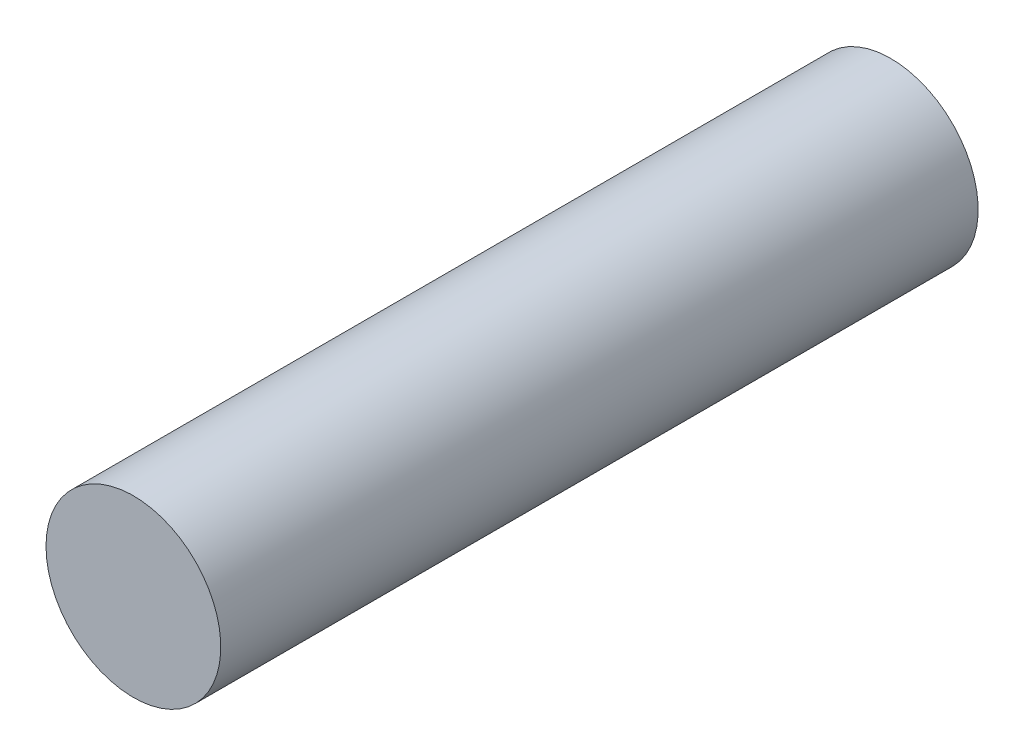
ISO-10303-21;
HEADER;
FILE_DESCRIPTION(('STEP AP214'),'2;1');
FILE_NAME('part.step','',(''),(''),'','','');
FILE_SCHEMA(('AUTOMOTIVE_DESIGN { 1 0 10303 214 1 1 1 1 }'));
ENDSEC;
DATA;
#1=APPLICATION_CONTEXT('core data for automotive mechanical design processes');
#2=APPLICATION_PROTOCOL_DEFINITION('international standard','automotive_design',2000,#1);
#3=PRODUCT_CONTEXT('',#1,'mechanical');
#4=PRODUCT('Part','Part','',(#3));
#5=PRODUCT_RELATED_PRODUCT_CATEGORY('part','',(#4));
#6=PRODUCT_DEFINITION_FORMATION('','',#4);
#7=PRODUCT_DEFINITION_CONTEXT('part definition',#1,'design');
#8=PRODUCT_DEFINITION('design','',#6,#7);
#9=PRODUCT_DEFINITION_SHAPE('','',#8);
#10=(LENGTH_UNIT() NAMED_UNIT(*) SI_UNIT(.MILLI.,.METRE.));
#11=(NAMED_UNIT(*) PLANE_ANGLE_UNIT() SI_UNIT($,.RADIAN.));
#12=(NAMED_UNIT(*) SI_UNIT($,.STERADIAN.) SOLID_ANGLE_UNIT());
#13=UNCERTAINTY_MEASURE_WITH_UNIT(LENGTH_MEASURE(1.E-05),#10,'distance_accuracy_value','');
#14=(GEOMETRIC_REPRESENTATION_CONTEXT(3) GLOBAL_UNCERTAINTY_ASSIGNED_CONTEXT((#13)) GLOBAL_UNIT_ASSIGNED_CONTEXT((#10,
#11,#12)) REPRESENTATION_CONTEXT('',''));
#15=CARTESIAN_POINT('',(0.,0.,0.));
#16=DIRECTION('',(0.,0.,1.));
#17=DIRECTION('',(1.,0.,0.));
#18=AXIS2_PLACEMENT_3D('',#15,#16,#17);
#19=CARTESIAN_POINT('',(0.,0.,13.));
#20=DIRECTION('',(0.,0.,-1.));
#21=DIRECTION('',(-1.,0.,0.));
#22=AXIS2_PLACEMENT_3D('',#19,#20,#21);
#23=CYLINDRICAL_SURFACE('',#22,1.5);
#24=CARTESIAN_POINT('',(0.,0.,13.));
#25=DIRECTION('',(0.,0.,1.));
#26=DIRECTION('',(1.,0.,0.));
#27=AXIS2_PLACEMENT_3D('',#24,#25,#26);
#28=CIRCLE('',#27,1.5);
#29=CARTESIAN_POINT('',(-1.5,0.,13.));
#30=VERTEX_POINT('',#29);
#31=EDGE_CURVE('E10',#30,#30,#28,.T.);
#32=CARTESIAN_POINT('',(0.,0.,0.));
#33=DIRECTION('',(0.,0.,1.));
#34=DIRECTION('',(1.,0.,0.));
#35=AXIS2_PLACEMENT_3D('',#32,#33,#34);
#36=CIRCLE('',#35,1.5);
#37=CARTESIAN_POINT('',(-1.5,0.,0.));
#38=VERTEX_POINT('',#37);
#39=EDGE_CURVE('E46',#38,#38,#36,.T.);
#40=CARTESIAN_POINT('',(-1.5,0.,13.));
#41=CARTESIAN_POINT('',(-1.5,0.,12.8645833333333));
#42=CARTESIAN_POINT('',(-1.5,0.,12.7291666666667));
#43=CARTESIAN_POINT('',(-1.5,0.,12.4583333333333));
#44=CARTESIAN_POINT('',(-1.5,0.,12.3229166666667));
#45=CARTESIAN_POINT('',(-1.5,0.,12.0520833333333));
#46=CARTESIAN_POINT('',(-1.5,0.,11.9166666666667));
#47=CARTESIAN_POINT('',(-1.5,0.,11.6458333333333));
#48=CARTESIAN_POINT('',(-1.5,0.,11.5104166666667));
#49=CARTESIAN_POINT('',(-1.5,0.,11.2395833333333));
#50=CARTESIAN_POINT('',(-1.5,0.,11.1041666666667));
#51=CARTESIAN_POINT('',(-1.5,0.,10.8333333333333));
#52=CARTESIAN_POINT('',(-1.5,0.,10.6979166666667));
#53=CARTESIAN_POINT('',(-1.5,0.,10.4270833333333));
#54=CARTESIAN_POINT('',(-1.5,0.,10.2916666666667));
#55=CARTESIAN_POINT('',(-1.5,0.,10.0208333333333));
#56=CARTESIAN_POINT('',(-1.5,0.,9.88541666666667));
#57=CARTESIAN_POINT('',(-1.5,0.,9.61458333333333));
#58=CARTESIAN_POINT('',(-1.5,0.,9.47916666666667));
#59=CARTESIAN_POINT('',(-1.5,0.,9.20833333333333));
#60=CARTESIAN_POINT('',(-1.5,0.,9.07291666666666));
#61=CARTESIAN_POINT('',(-1.5,0.,8.80208333333333));
#62=CARTESIAN_POINT('',(-1.5,0.,8.66666666666667));
#63=CARTESIAN_POINT('',(-1.5,0.,8.39583333333333));
#64=CARTESIAN_POINT('',(-1.5,0.,8.26041666666667));
#65=CARTESIAN_POINT('',(-1.5,0.,7.98958333333333));
#66=CARTESIAN_POINT('',(-1.5,0.,7.85416666666667));
#67=CARTESIAN_POINT('',(-1.5,0.,7.58333333333333));
#68=CARTESIAN_POINT('',(-1.5,0.,7.44791666666667));
#69=CARTESIAN_POINT('',(-1.5,0.,7.17708333333333));
#70=CARTESIAN_POINT('',(-1.5,0.,7.04166666666667));
#71=CARTESIAN_POINT('',(-1.5,0.,6.77083333333333));
#72=CARTESIAN_POINT('',(-1.5,0.,6.63541666666667));
#73=CARTESIAN_POINT('',(-1.5,0.,6.36458333333333));
#74=CARTESIAN_POINT('',(-1.5,0.,6.22916666666667));
#75=CARTESIAN_POINT('',(-1.5,0.,5.95833333333333));
#76=CARTESIAN_POINT('',(-1.5,0.,5.82291666666667));
#77=CARTESIAN_POINT('',(-1.5,0.,5.55208333333333));
#78=CARTESIAN_POINT('',(-1.5,0.,5.41666666666667));
#79=CARTESIAN_POINT('',(-1.5,0.,5.14583333333333));
#80=CARTESIAN_POINT('',(-1.5,0.,5.01041666666667));
#81=CARTESIAN_POINT('',(-1.5,0.,4.73958333333333));
#82=CARTESIAN_POINT('',(-1.5,0.,4.60416666666667));
#83=CARTESIAN_POINT('',(-1.5,0.,4.33333333333333));
#84=CARTESIAN_POINT('',(-1.5,0.,4.19791666666667));
#85=CARTESIAN_POINT('',(-1.5,0.,3.92708333333333));
#86=CARTESIAN_POINT('',(-1.5,0.,3.79166666666667));
#87=CARTESIAN_POINT('',(-1.5,0.,3.52083333333333));
#88=CARTESIAN_POINT('',(-1.5,0.,3.38541666666667));
#89=CARTESIAN_POINT('',(-1.5,0.,3.11458333333333));
#90=CARTESIAN_POINT('',(-1.5,0.,2.97916666666667));
#91=CARTESIAN_POINT('',(-1.5,0.,2.70833333333333));
#92=CARTESIAN_POINT('',(-1.5,0.,2.57291666666667));
#93=CARTESIAN_POINT('',(-1.5,0.,2.30208333333333));
#94=CARTESIAN_POINT('',(-1.5,0.,2.16666666666667));
#95=CARTESIAN_POINT('',(-1.5,0.,1.89583333333333));
#96=CARTESIAN_POINT('',(-1.5,0.,1.76041666666667));
#97=CARTESIAN_POINT('',(-1.5,0.,1.48958333333333));
#98=CARTESIAN_POINT('',(-1.5,0.,1.35416666666667));
#99=CARTESIAN_POINT('',(-1.5,0.,1.08333333333333));
#100=CARTESIAN_POINT('',(-1.5,0.,0.947916666666667));
#101=CARTESIAN_POINT('',(-1.5,0.,0.677083333333334));
#102=CARTESIAN_POINT('',(-1.5,0.,0.541666666666667));
#103=CARTESIAN_POINT('',(-1.5,0.,0.270833333333334));
#104=CARTESIAN_POINT('',(-1.5,0.,0.135416666666667));
#105=CARTESIAN_POINT('',(-1.5,0.,0.));
#106=B_SPLINE_CURVE_WITH_KNOTS('',3,(#40,#41,#42,#43,#44,#45,#46,#47,#48,#49,#50,#51,#52,#53,
#54,#55,#56,#57,#58,#59,#60,#61,#62,#63,#64,#65,#66,#67,#68,#69,#70,#71,#72,#73,#74,#75,#76,#77,
#78,#79,#80,#81,#82,#83,#84,#85,#86,#87,#88,#89,#90,#91,#92,#93,#94,#95,#96,#97,#98,#99,#100,
#101,#102,#103,#104,#105),.UNSPECIFIED.,.F.,.F.,(4,2,2,2,2,2,2,2,2,2,2,2,2,2,2,2,2,2,2,2,2,2,2,
2,2,2,2,2,2,2,2,2,4),(0.,0.40625,0.812500000000001,1.21875,1.625,2.03125,2.4375,2.84375,3.25,
3.65625,4.0625,4.46875,4.875,5.28125,5.6875,6.09375,6.5,6.90625,7.3125,7.71875,8.125,8.53125,
8.9375,9.34375,9.75,10.15625,10.5625,10.96875,11.375,11.78125,12.1875,12.59375,13.),.UNSPECIFIED.);
#107=EDGE_CURVE('BSEAM43',#30,#38,#106,.T.);
#108=ORIENTED_EDGE('',*,*,#31,.F.);
#109=ORIENTED_EDGE('',*,*,#39,.T.);
#110=ORIENTED_EDGE('',*,*,#107,.T.);
#111=ORIENTED_EDGE('',*,*,#107,.F.);
#112=EDGE_LOOP('',(#108,#110,#109,#111));
#113=FACE_BOUND('',#112,.T.);
#114=ADVANCED_FACE('F43',(#113),#23,.T.);
#115=CARTESIAN_POINT('',(0.,0.,13.));
#116=DIRECTION('',(0.,0.,1.));
#117=DIRECTION('',(1.,0.,0.));
#118=AXIS2_PLACEMENT_3D('',#115,#116,#117);
#119=PLANE('',#118);
#120=ORIENTED_EDGE('',*,*,#31,.T.);
#121=EDGE_LOOP('',(#120));
#122=FACE_BOUND('',#121,.T.);
#123=ADVANCED_FACE('F60',(#122),#119,.T.);
#124=CARTESIAN_POINT('',(0.,0.,0.));
#125=DIRECTION('',(0.,0.,1.));
#126=DIRECTION('',(1.,0.,0.));
#127=AXIS2_PLACEMENT_3D('',#124,#125,#126);
#128=PLANE('',#127);
#129=ORIENTED_EDGE('',*,*,#39,.F.);
#130=EDGE_LOOP('',(#129));
#131=FACE_BOUND('',#130,.T.);
#132=ADVANCED_FACE('F58',(#131),#128,.F.);
#133=CLOSED_SHELL('',(#114,#123,#132));
#134=MANIFOLD_SOLID_BREP('B2',#133);
#135=ADVANCED_BREP_SHAPE_REPRESENTATION('',(#18,#134),#14);
#136=SHAPE_DEFINITION_REPRESENTATION(#9,#135);
ENDSEC;
END-ISO-10303-21;
